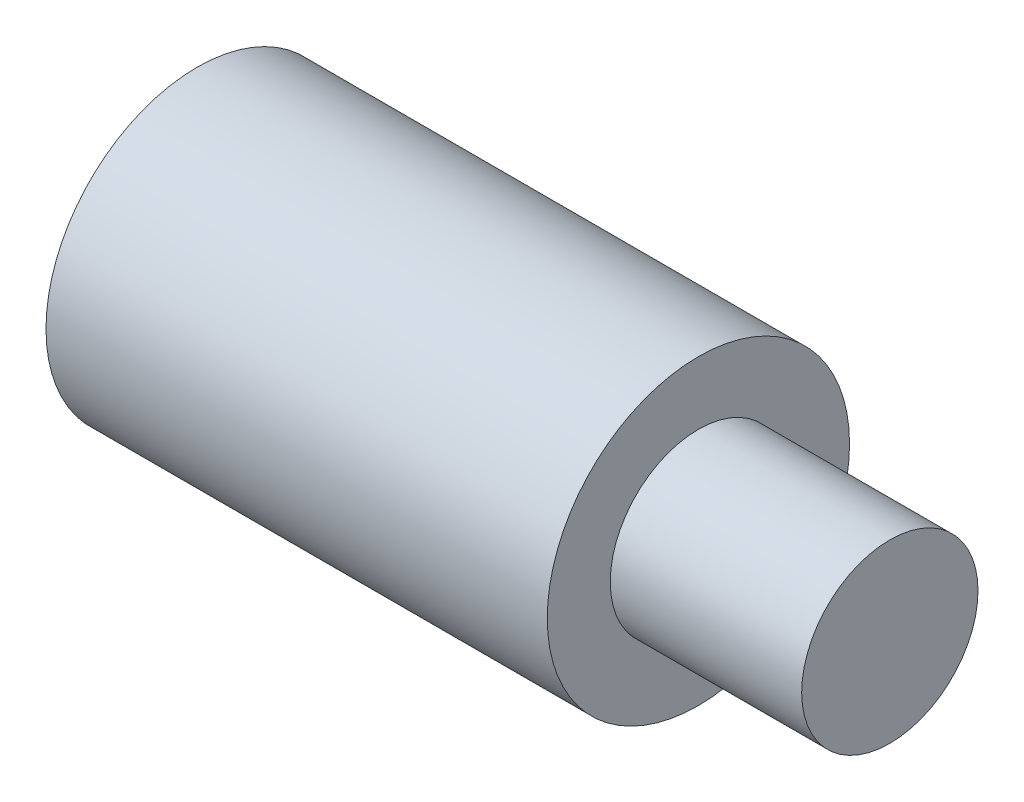
ISO-10303-21;
HEADER;
FILE_DESCRIPTION(('STEP AP214'),'2;1');
FILE_NAME('part.step','',(''),(''),'','','');
FILE_SCHEMA(('AUTOMOTIVE_DESIGN { 1 0 10303 214 1 1 1 1 }'));
ENDSEC;
DATA;
#1=APPLICATION_CONTEXT('core data for automotive mechanical design processes');
#2=APPLICATION_PROTOCOL_DEFINITION('international standard','automotive_design',2000,#1);
#3=PRODUCT_CONTEXT('',#1,'mechanical');
#4=PRODUCT('Part','Part','',(#3));
#5=PRODUCT_RELATED_PRODUCT_CATEGORY('part','',(#4));
#6=PRODUCT_DEFINITION_FORMATION('','',#4);
#7=PRODUCT_DEFINITION_CONTEXT('part definition',#1,'design');
#8=PRODUCT_DEFINITION('design','',#6,#7);
#9=PRODUCT_DEFINITION_SHAPE('','',#8);
#10=(LENGTH_UNIT() NAMED_UNIT(*) SI_UNIT(.MILLI.,.METRE.));
#11=(NAMED_UNIT(*) PLANE_ANGLE_UNIT() SI_UNIT($,.RADIAN.));
#12=(NAMED_UNIT(*) SI_UNIT($,.STERADIAN.) SOLID_ANGLE_UNIT());
#13=UNCERTAINTY_MEASURE_WITH_UNIT(LENGTH_MEASURE(1.E-05),#10,'distance_accuracy_value','');
#14=(GEOMETRIC_REPRESENTATION_CONTEXT(3) GLOBAL_UNCERTAINTY_ASSIGNED_CONTEXT((#13)) GLOBAL_UNIT_ASSIGNED_CONTEXT((#10,
#11,#12)) REPRESENTATION_CONTEXT('',''));
#15=CARTESIAN_POINT('',(0.,0.,0.));
#16=DIRECTION('',(0.,0.,1.));
#17=DIRECTION('',(1.,0.,0.));
#18=AXIS2_PLACEMENT_3D('',#15,#16,#17);
#19=CARTESIAN_POINT('',(7.6,0.,0.));
#20=DIRECTION('',(-1.,0.,0.));
#21=DIRECTION('',(0.,0.,1.));
#22=AXIS2_PLACEMENT_3D('',#19,#20,#21);
#23=PLANE('',#22);
#24=CARTESIAN_POINT('',(7.6,0.,0.));
#25=DIRECTION('',(-1.,0.,0.));
#26=DIRECTION('',(0.,0.,1.));
#27=AXIS2_PLACEMENT_3D('',#24,#25,#26);
#28=CIRCLE('',#27,3.5);
#29=CARTESIAN_POINT('',(7.6,0.,3.5));
#30=VERTEX_POINT('',#29);
#31=EDGE_CURVE('E10',#30,#30,#28,.T.);
#32=ORIENTED_EDGE('',*,*,#31,.F.);
#33=EDGE_LOOP('',(#32));
#34=FACE_BOUND('',#33,.T.);
#35=ADVANCED_FACE('F39',(#34),#23,.F.);
#36=CARTESIAN_POINT('',(-300.,0.,0.));
#37=DIRECTION('',(-1.,0.,0.));
#38=DIRECTION('',(0.,0.,1.));
#39=AXIS2_PLACEMENT_3D('',#36,#37,#38);
#40=CYLINDRICAL_SURFACE('',#39,3.5);
#41=CARTESIAN_POINT('',(0.,0.,0.));
#42=DIRECTION('',(-1.,0.,0.));
#43=DIRECTION('',(0.,0.,1.));
#44=AXIS2_PLACEMENT_3D('',#41,#42,#43);
#45=CIRCLE('',#44,3.5);
#46=CARTESIAN_POINT('',(0.,0.,3.5));
#47=VERTEX_POINT('',#46);
#48=EDGE_CURVE('E46',#47,#47,#45,.T.);
#49=ORIENTED_EDGE('',*,*,#48,.F.);
#50=EDGE_LOOP('',(#49));
#51=FACE_BOUND('',#50,.T.);
#52=ORIENTED_EDGE('',*,*,#31,.T.);
#53=EDGE_LOOP('',(#52));
#54=FACE_BOUND('',#53,.T.);
#55=ADVANCED_FACE('F81',(#51,#54),#40,.T.);
#56=CARTESIAN_POINT('',(0.,3.5,0.));
#57=DIRECTION('',(-1.,0.,0.));
#58=DIRECTION('',(0.,0.,1.));
#59=AXIS2_PLACEMENT_3D('',#56,#57,#58);
#60=PLANE('',#59);
#61=CARTESIAN_POINT('',(0.,0.,0.));
#62=DIRECTION('',(-1.,0.,0.));
#63=DIRECTION('',(0.,0.,1.));
#64=AXIS2_PLACEMENT_3D('',#61,#62,#63);
#65=CIRCLE('',#64,6.);
#66=CARTESIAN_POINT('',(0.,0.,6.));
#67=VERTEX_POINT('',#66);
#68=EDGE_CURVE('E49',#67,#67,#65,.T.);
#69=ORIENTED_EDGE('',*,*,#68,.F.);
#70=EDGE_LOOP('',(#69));
#71=FACE_BOUND('',#70,.T.);
#72=ORIENTED_EDGE('',*,*,#48,.T.);
#73=EDGE_LOOP('',(#72));
#74=FACE_BOUND('',#73,.T.);
#75=ADVANCED_FACE('F76',(#71,#74),#60,.F.);
#76=CARTESIAN_POINT('',(-300.,0.,0.));
#77=DIRECTION('',(-1.,0.,0.));
#78=DIRECTION('',(0.,0.,1.));
#79=AXIS2_PLACEMENT_3D('',#76,#77,#78);
#80=CYLINDRICAL_SURFACE('',#79,6.);
#81=CARTESIAN_POINT('',(-19.9,0.,0.));
#82=DIRECTION('',(-1.,0.,0.));
#83=DIRECTION('',(0.,0.,1.));
#84=AXIS2_PLACEMENT_3D('',#81,#82,#83);
#85=CIRCLE('',#84,6.);
#86=CARTESIAN_POINT('',(-19.9,0.,6.));
#87=VERTEX_POINT('',#86);
#88=EDGE_CURVE('E54',#87,#87,#85,.T.);
#89=ORIENTED_EDGE('',*,*,#88,.F.);
#90=EDGE_LOOP('',(#89));
#91=FACE_BOUND('',#90,.T.);
#92=ORIENTED_EDGE('',*,*,#68,.T.);
#93=EDGE_LOOP('',(#92));
#94=FACE_BOUND('',#93,.T.);
#95=ADVANCED_FACE('F67',(#91,#94),#80,.T.);
#96=CARTESIAN_POINT('',(-19.9,6.,0.));
#97=DIRECTION('',(1.,0.,0.));
#98=DIRECTION('',(0.,0.,-1.));
#99=AXIS2_PLACEMENT_3D('',#96,#97,#98);
#100=PLANE('',#99);
#101=CARTESIAN_POINT('',(-19.9,0.,0.));
#102=DIRECTION('',(1.,0.,0.));
#103=DIRECTION('',(0.,0.,-1.));
#104=AXIS2_PLACEMENT_3D('',#101,#102,#103);
#105=CIRCLE('',#104,1.5875);
#106=CARTESIAN_POINT('',(-19.9,0.,-1.5875));
#107=VERTEX_POINT('',#106);
#108=EDGE_CURVE('E45',#107,#107,#105,.F.);
#109=ORIENTED_EDGE('',*,*,#108,.F.);
#110=EDGE_LOOP('',(#109));
#111=FACE_BOUND('',#110,.T.);
#112=ORIENTED_EDGE('',*,*,#88,.T.);
#113=EDGE_LOOP('',(#112));
#114=FACE_BOUND('',#113,.T.);
#115=ADVANCED_FACE('F66',(#111,#114),#100,.F.);
#116=CARTESIAN_POINT('',(-300.,0.,0.));
#117=DIRECTION('',(-1.,0.,0.));
#118=DIRECTION('',(0.,0.,1.));
#119=AXIS2_PLACEMENT_3D('',#116,#117,#118);
#120=CYLINDRICAL_SURFACE('',#119,1.5875);
#121=CARTESIAN_POINT('',(-7.19999999999998,0.,0.));
#122=DIRECTION('',(-1.,0.,0.));
#123=DIRECTION('',(0.,0.,1.));
#124=AXIS2_PLACEMENT_3D('',#121,#122,#123);
#125=CIRCLE('',#124,1.5875);
#126=CARTESIAN_POINT('',(-7.19999999999998,0.,1.5875));
#127=VERTEX_POINT('',#126);
#128=EDGE_CURVE('E59',#127,#127,#125,.T.);
#129=ORIENTED_EDGE('',*,*,#128,.F.);
#130=EDGE_LOOP('',(#129));
#131=FACE_BOUND('',#130,.T.);
#132=ORIENTED_EDGE('',*,*,#108,.T.);
#133=EDGE_LOOP('',(#132));
#134=FACE_BOUND('',#133,.T.);
#135=ADVANCED_FACE('F64',(#131,#134),#120,.F.);
#136=CARTESIAN_POINT('',(-7.2,1.5875,0.));
#137=DIRECTION('',(-1.,0.,0.));
#138=DIRECTION('',(0.,0.,1.));
#139=AXIS2_PLACEMENT_3D('',#136,#137,#138);
#140=PLANE('',#139);
#141=ORIENTED_EDGE('',*,*,#128,.T.);
#142=EDGE_LOOP('',(#141));
#143=FACE_BOUND('',#142,.T.);
#144=ADVANCED_FACE('F94',(#143),#140,.T.);
#145=CLOSED_SHELL('',(#35,#55,#75,#95,#115,#135,#144));
#146=MANIFOLD_SOLID_BREP('B2',#145);
#147=ADVANCED_BREP_SHAPE_REPRESENTATION('',(#18,#146),#14);
#148=SHAPE_DEFINITION_REPRESENTATION(#9,#147);
ENDSEC;
END-ISO-10303-21;
